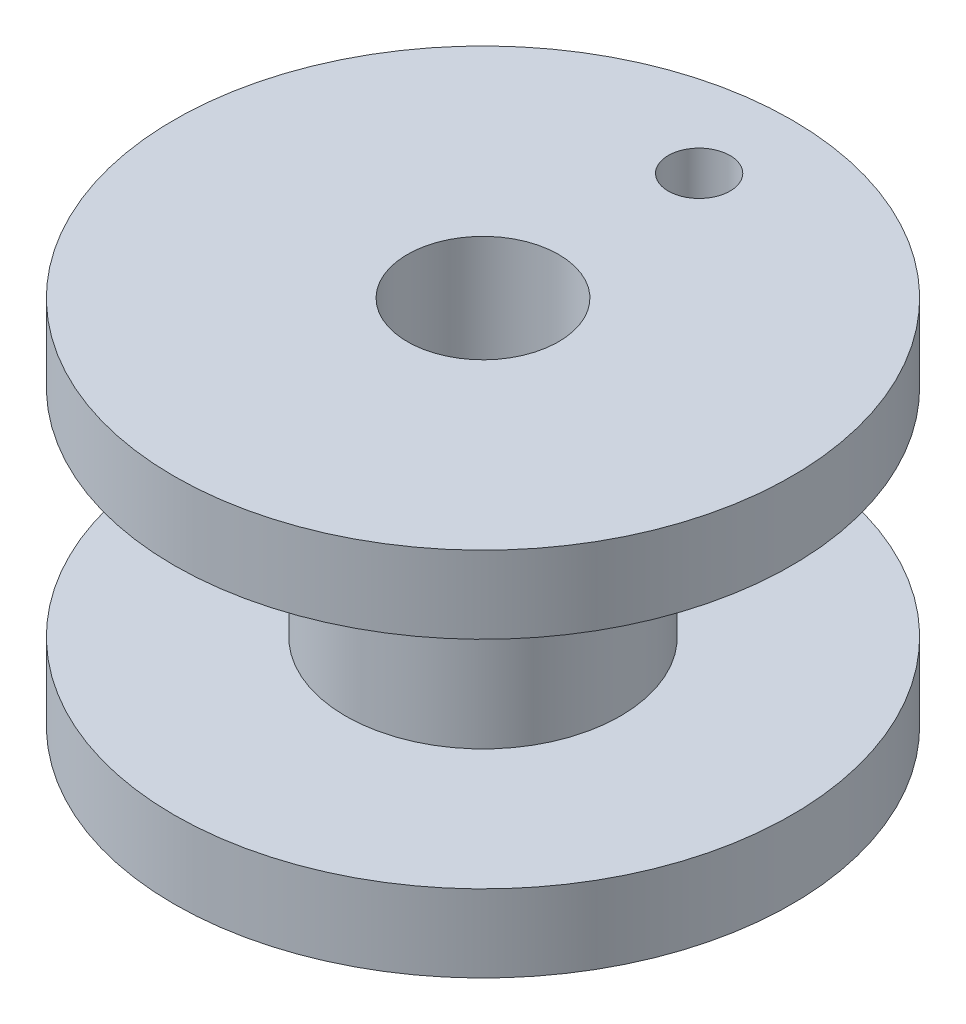
ISO-10303-21;
HEADER;
FILE_DESCRIPTION(('STEP AP214'),'2;1');
FILE_NAME('part.step','',(''),(''),'','','');
FILE_SCHEMA(('AUTOMOTIVE_DESIGN { 1 0 10303 214 1 1 1 1 }'));
ENDSEC;
DATA;
#1=APPLICATION_CONTEXT('core data for automotive mechanical design processes');
#2=APPLICATION_PROTOCOL_DEFINITION('international standard','automotive_design',2000,#1);
#3=PRODUCT_CONTEXT('',#1,'mechanical');
#4=PRODUCT('Part','Part','',(#3));
#5=PRODUCT_RELATED_PRODUCT_CATEGORY('part','',(#4));
#6=PRODUCT_DEFINITION_FORMATION('','',#4);
#7=PRODUCT_DEFINITION_CONTEXT('part definition',#1,'design');
#8=PRODUCT_DEFINITION('design','',#6,#7);
#9=PRODUCT_DEFINITION_SHAPE('','',#8);
#10=(LENGTH_UNIT() NAMED_UNIT(*) SI_UNIT(.MILLI.,.METRE.));
#11=(NAMED_UNIT(*) PLANE_ANGLE_UNIT() SI_UNIT($,.RADIAN.));
#12=(NAMED_UNIT(*) SI_UNIT($,.STERADIAN.) SOLID_ANGLE_UNIT());
#13=UNCERTAINTY_MEASURE_WITH_UNIT(LENGTH_MEASURE(1.E-05),#10,'distance_accuracy_value','');
#14=(GEOMETRIC_REPRESENTATION_CONTEXT(3) GLOBAL_UNCERTAINTY_ASSIGNED_CONTEXT((#13)) GLOBAL_UNIT_ASSIGNED_CONTEXT((#10,
#11,#12)) REPRESENTATION_CONTEXT('',''));
#15=CARTESIAN_POINT('',(0.,0.,0.));
#16=DIRECTION('',(0.,0.,1.));
#17=DIRECTION('',(1.,0.,0.));
#18=AXIS2_PLACEMENT_3D('',#15,#16,#17);
#19=CARTESIAN_POINT('',(0.,7.62,0.));
#20=DIRECTION('',(0.,-1.,0.));
#21=DIRECTION('',(0.,0.,-1.));
#22=AXIS2_PLACEMENT_3D('',#19,#20,#21);
#23=CYLINDRICAL_SURFACE('',#22,3.1115);
#24=CARTESIAN_POINT('',(0.,0.,0.));
#25=DIRECTION('',(0.,1.,0.));
#26=DIRECTION('',(0.,0.,1.));
#27=AXIS2_PLACEMENT_3D('',#24,#25,#26);
#28=CIRCLE('',#27,3.1115);
#29=CARTESIAN_POINT('',(0.,0.,-3.1115));
#30=VERTEX_POINT('',#29);
#31=EDGE_CURVE('E10',#30,#30,#28,.T.);
#32=CARTESIAN_POINT('',(0.,15.24,0.));
#33=DIRECTION('',(0.,1.,0.));
#34=DIRECTION('',(0.,0.,1.));
#35=AXIS2_PLACEMENT_3D('',#32,#33,#34);
#36=CIRCLE('',#35,3.1115);
#37=CARTESIAN_POINT('',(0.,15.24,-3.1115));
#38=VERTEX_POINT('',#37);
#39=EDGE_CURVE('E71',#38,#38,#36,.T.);
#40=CARTESIAN_POINT('',(0.,0.,-3.1115));
#41=CARTESIAN_POINT('',(0.,0.15875,-3.1115));
#42=CARTESIAN_POINT('',(0.,0.3175,-3.1115));
#43=CARTESIAN_POINT('',(0.,0.635,-3.1115));
#44=CARTESIAN_POINT('',(0.,0.79375,-3.1115));
#45=CARTESIAN_POINT('',(0.,1.11125,-3.1115));
#46=CARTESIAN_POINT('',(0.,1.27,-3.1115));
#47=CARTESIAN_POINT('',(0.,1.5875,-3.1115));
#48=CARTESIAN_POINT('',(0.,1.74625,-3.1115));
#49=CARTESIAN_POINT('',(0.,2.06375,-3.1115));
#50=CARTESIAN_POINT('',(0.,2.2225,-3.1115));
#51=CARTESIAN_POINT('',(0.,2.54,-3.1115));
#52=CARTESIAN_POINT('',(0.,2.69875,-3.1115));
#53=CARTESIAN_POINT('',(0.,3.01625,-3.1115));
#54=CARTESIAN_POINT('',(0.,3.175,-3.1115));
#55=CARTESIAN_POINT('',(0.,3.4925,-3.1115));
#56=CARTESIAN_POINT('',(0.,3.65125,-3.1115));
#57=CARTESIAN_POINT('',(0.,3.96875,-3.1115));
#58=CARTESIAN_POINT('',(0.,4.1275,-3.1115));
#59=CARTESIAN_POINT('',(0.,4.445,-3.1115));
#60=CARTESIAN_POINT('',(0.,4.60375,-3.1115));
#61=CARTESIAN_POINT('',(0.,4.92125,-3.1115));
#62=CARTESIAN_POINT('',(0.,5.08,-3.1115));
#63=CARTESIAN_POINT('',(0.,5.3975,-3.1115));
#64=CARTESIAN_POINT('',(0.,5.55625,-3.1115));
#65=CARTESIAN_POINT('',(0.,5.87375,-3.1115));
#66=CARTESIAN_POINT('',(0.,6.0325,-3.1115));
#67=CARTESIAN_POINT('',(0.,6.35,-3.1115));
#68=CARTESIAN_POINT('',(0.,6.50875,-3.1115));
#69=CARTESIAN_POINT('',(0.,6.82625,-3.1115));
#70=CARTESIAN_POINT('',(0.,6.985,-3.1115));
#71=CARTESIAN_POINT('',(0.,7.3025,-3.1115));
#72=CARTESIAN_POINT('',(0.,7.46125,-3.1115));
#73=CARTESIAN_POINT('',(0.,7.77875,-3.1115));
#74=CARTESIAN_POINT('',(0.,7.9375,-3.1115));
#75=CARTESIAN_POINT('',(0.,8.255,-3.1115));
#76=CARTESIAN_POINT('',(0.,8.41375,-3.1115));
#77=CARTESIAN_POINT('',(0.,8.73125,-3.1115));
#78=CARTESIAN_POINT('',(0.,8.89,-3.1115));
#79=CARTESIAN_POINT('',(0.,9.2075,-3.1115));
#80=CARTESIAN_POINT('',(0.,9.36625,-3.1115));
#81=CARTESIAN_POINT('',(0.,9.68375,-3.1115));
#82=CARTESIAN_POINT('',(0.,9.8425,-3.1115));
#83=CARTESIAN_POINT('',(0.,10.16,-3.1115));
#84=CARTESIAN_POINT('',(0.,10.31875,-3.1115));
#85=CARTESIAN_POINT('',(0.,10.63625,-3.1115));
#86=CARTESIAN_POINT('',(0.,10.795,-3.1115));
#87=CARTESIAN_POINT('',(0.,11.1125,-3.1115));
#88=CARTESIAN_POINT('',(0.,11.27125,-3.1115));
#89=CARTESIAN_POINT('',(0.,11.58875,-3.1115));
#90=CARTESIAN_POINT('',(0.,11.7475,-3.1115));
#91=CARTESIAN_POINT('',(0.,12.065,-3.1115));
#92=CARTESIAN_POINT('',(0.,12.22375,-3.1115));
#93=CARTESIAN_POINT('',(0.,12.54125,-3.1115));
#94=CARTESIAN_POINT('',(0.,12.7,-3.1115));
#95=CARTESIAN_POINT('',(0.,13.0175,-3.1115));
#96=CARTESIAN_POINT('',(0.,13.17625,-3.1115));
#97=CARTESIAN_POINT('',(0.,13.49375,-3.1115));
#98=CARTESIAN_POINT('',(0.,13.6525,-3.1115));
#99=CARTESIAN_POINT('',(0.,13.97,-3.1115));
#100=CARTESIAN_POINT('',(0.,14.12875,-3.1115));
#101=CARTESIAN_POINT('',(0.,14.44625,-3.1115));
#102=CARTESIAN_POINT('',(0.,14.605,-3.1115));
#103=CARTESIAN_POINT('',(0.,14.9225,-3.1115));
#104=CARTESIAN_POINT('',(0.,15.08125,-3.1115));
#105=CARTESIAN_POINT('',(0.,15.24,-3.1115));
#106=B_SPLINE_CURVE_WITH_KNOTS('',3,(#40,#41,#42,#43,#44,#45,#46,#47,#48,#49,#50,#51,#52,#53,
#54,#55,#56,#57,#58,#59,#60,#61,#62,#63,#64,#65,#66,#67,#68,#69,#70,#71,#72,#73,#74,#75,#76,#77,
#78,#79,#80,#81,#82,#83,#84,#85,#86,#87,#88,#89,#90,#91,#92,#93,#94,#95,#96,#97,#98,#99,#100,
#101,#102,#103,#104,#105),.UNSPECIFIED.,.F.,.F.,(4,2,2,2,2,2,2,2,2,2,2,2,2,2,2,2,2,2,2,2,2,2,2,
2,2,2,2,2,2,2,2,2,4),(0.,0.47625,0.9525,1.42875,1.905,2.38125,2.8575,3.33375,3.81,4.28625,
4.7625,5.23875,5.715,6.19125,6.6675,7.14375,7.62,8.09625,8.5725,9.04875,9.525,10.00125,10.4775,
10.95375,11.43,11.90625,12.3825,12.85875,13.335,13.81125,14.2875,14.76375,15.24),.UNSPECIFIED.);
#107=EDGE_CURVE('BSEAM45',#30,#38,#106,.T.);
#108=ORIENTED_EDGE('',*,*,#31,.F.);
#109=ORIENTED_EDGE('',*,*,#39,.T.);
#110=ORIENTED_EDGE('',*,*,#107,.T.);
#111=ORIENTED_EDGE('',*,*,#107,.F.);
#112=EDGE_LOOP('',(#108,#110,#109,#111));
#113=FACE_BOUND('',#112,.T.);
#114=ADVANCED_FACE('F45',(#113),#23,.F.);
#115=CARTESIAN_POINT('',(0.,7.62,0.));
#116=DIRECTION('',(0.,-1.,0.));
#117=DIRECTION('',(0.,0.,-1.));
#118=AXIS2_PLACEMENT_3D('',#115,#116,#117);
#119=CYLINDRICAL_SURFACE('',#118,5.6515);
#120=CARTESIAN_POINT('',(0.,12.065,0.));
#121=DIRECTION('',(0.,1.,0.));
#122=DIRECTION('',(0.,0.,1.));
#123=AXIS2_PLACEMENT_3D('',#120,#121,#122);
#124=CIRCLE('',#123,5.6515);
#125=CARTESIAN_POINT('',(0.,12.065,-5.6515));
#126=VERTEX_POINT('',#125);
#127=EDGE_CURVE('E97',#126,#126,#124,.T.);
#128=CARTESIAN_POINT('',(0.,3.175,0.));
#129=DIRECTION('',(0.,1.,0.));
#130=DIRECTION('',(0.,0.,1.));
#131=AXIS2_PLACEMENT_3D('',#128,#129,#130);
#132=CIRCLE('',#131,5.6515);
#133=CARTESIAN_POINT('',(0.,3.175,-5.6515));
#134=VERTEX_POINT('',#133);
#135=EDGE_CURVE('E57',#134,#134,#132,.T.);
#136=CARTESIAN_POINT('',(0.,12.065,-5.6515));
#137=CARTESIAN_POINT('',(0.,11.9723958333333,-5.6515));
#138=CARTESIAN_POINT('',(0.,11.8797916666667,-5.6515));
#139=CARTESIAN_POINT('',(0.,11.6945833333333,-5.6515));
#140=CARTESIAN_POINT('',(0.,11.6019791666667,-5.6515));
#141=CARTESIAN_POINT('',(0.,11.4167708333333,-5.6515));
#142=CARTESIAN_POINT('',(0.,11.3241666666667,-5.6515));
#143=CARTESIAN_POINT('',(0.,11.1389583333333,-5.6515));
#144=CARTESIAN_POINT('',(0.,11.0463541666667,-5.6515));
#145=CARTESIAN_POINT('',(0.,10.8611458333333,-5.6515));
#146=CARTESIAN_POINT('',(0.,10.7685416666667,-5.6515));
#147=CARTESIAN_POINT('',(0.,10.5833333333333,-5.6515));
#148=CARTESIAN_POINT('',(0.,10.4907291666667,-5.6515));
#149=CARTESIAN_POINT('',(0.,10.3055208333333,-5.6515));
#150=CARTESIAN_POINT('',(0.,10.2129166666667,-5.6515));
#151=CARTESIAN_POINT('',(0.,10.0277083333333,-5.6515));
#152=CARTESIAN_POINT('',(0.,9.93510416666666,-5.6515));
#153=CARTESIAN_POINT('',(0.,9.74989583333333,-5.6515));
#154=CARTESIAN_POINT('',(0.,9.65729166666666,-5.6515));
#155=CARTESIAN_POINT('',(0.,9.47208333333333,-5.6515));
#156=CARTESIAN_POINT('',(0.,9.37947916666666,-5.6515));
#157=CARTESIAN_POINT('',(0.,9.19427083333333,-5.6515));
#158=CARTESIAN_POINT('',(0.,9.10166666666666,-5.6515));
#159=CARTESIAN_POINT('',(0.,8.91645833333333,-5.6515));
#160=CARTESIAN_POINT('',(0.,8.82385416666666,-5.6515));
#161=CARTESIAN_POINT('',(0.,8.63864583333333,-5.6515));
#162=CARTESIAN_POINT('',(0.,8.54604166666666,-5.6515));
#163=CARTESIAN_POINT('',(0.,8.36083333333333,-5.6515));
#164=CARTESIAN_POINT('',(0.,8.26822916666666,-5.6515));
#165=CARTESIAN_POINT('',(0.,8.08302083333333,-5.6515));
#166=CARTESIAN_POINT('',(0.,7.99041666666666,-5.6515));
#167=CARTESIAN_POINT('',(0.,7.80520833333333,-5.6515));
#168=CARTESIAN_POINT('',(0.,7.71260416666667,-5.6515));
#169=CARTESIAN_POINT('',(0.,7.52739583333333,-5.6515));
#170=CARTESIAN_POINT('',(0.,7.43479166666666,-5.6515));
#171=CARTESIAN_POINT('',(0.,7.24958333333333,-5.6515));
#172=CARTESIAN_POINT('',(0.,7.15697916666667,-5.6515));
#173=CARTESIAN_POINT('',(0.,6.97177083333333,-5.6515));
#174=CARTESIAN_POINT('',(0.,6.87916666666667,-5.6515));
#175=CARTESIAN_POINT('',(0.,6.69395833333333,-5.6515));
#176=CARTESIAN_POINT('',(0.,6.60135416666667,-5.6515));
#177=CARTESIAN_POINT('',(0.,6.41614583333333,-5.6515));
#178=CARTESIAN_POINT('',(0.,6.32354166666666,-5.6515));
#179=CARTESIAN_POINT('',(0.,6.13833333333333,-5.6515));
#180=CARTESIAN_POINT('',(0.,6.04572916666667,-5.6515));
#181=CARTESIAN_POINT('',(0.,5.86052083333333,-5.6515));
#182=CARTESIAN_POINT('',(0.,5.76791666666667,-5.6515));
#183=CARTESIAN_POINT('',(0.,5.58270833333333,-5.6515));
#184=CARTESIAN_POINT('',(0.,5.49010416666667,-5.6515));
#185=CARTESIAN_POINT('',(0.,5.30489583333333,-5.6515));
#186=CARTESIAN_POINT('',(0.,5.21229166666667,-5.6515));
#187=CARTESIAN_POINT('',(0.,5.02708333333333,-5.6515));
#188=CARTESIAN_POINT('',(0.,4.93447916666667,-5.6515));
#189=CARTESIAN_POINT('',(0.,4.74927083333333,-5.6515));
#190=CARTESIAN_POINT('',(0.,4.65666666666667,-5.6515));
#191=CARTESIAN_POINT('',(0.,4.47145833333333,-5.6515));
#192=CARTESIAN_POINT('',(0.,4.37885416666667,-5.6515));
#193=CARTESIAN_POINT('',(0.,4.19364583333333,-5.6515));
#194=CARTESIAN_POINT('',(0.,4.10104166666667,-5.6515));
#195=CARTESIAN_POINT('',(0.,3.91583333333333,-5.6515));
#196=CARTESIAN_POINT('',(0.,3.82322916666667,-5.6515));
#197=CARTESIAN_POINT('',(0.,3.63802083333333,-5.6515));
#198=CARTESIAN_POINT('',(0.,3.54541666666667,-5.6515));
#199=CARTESIAN_POINT('',(0.,3.36020833333333,-5.6515));
#200=CARTESIAN_POINT('',(0.,3.26760416666667,-5.6515));
#201=CARTESIAN_POINT('',(0.,3.175,-5.6515));
#202=B_SPLINE_CURVE_WITH_KNOTS('',3,(#136,#137,#138,#139,#140,#141,#142,#143,#144,#145,#146,
#147,#148,#149,#150,#151,#152,#153,#154,#155,#156,#157,#158,#159,#160,#161,#162,#163,#164,#165,
#166,#167,#168,#169,#170,#171,#172,#173,#174,#175,#176,#177,#178,#179,#180,#181,#182,#183,#184,
#185,#186,#187,#188,#189,#190,#191,#192,#193,#194,#195,#196,#197,#198,#199,#200,#201),
.UNSPECIFIED.,.F.,.F.,(4,2,2,2,2,2,2,2,2,2,2,2,2,2,2,2,2,2,2,2,2,2,2,2,2,2,2,2,2,2,2,2,4),(0.,
0.2778125,0.555624999999999,0.833437499999999,1.11125,1.3890625,1.666875,1.9446875,2.2225,
2.5003125,2.778125,3.0559375,3.33375,3.6115625,3.889375,4.1671875,4.445,4.7228125,5.000625,
5.2784375,5.55625,5.8340625,6.111875,6.3896875,6.6675,6.9453125,7.223125,7.5009375,7.77875,
8.0565625,8.334375,8.6121875,8.89),.UNSPECIFIED.);
#203=EDGE_CURVE('BSEAM131',#126,#134,#202,.T.);
#204=ORIENTED_EDGE('',*,*,#127,.F.);
#205=ORIENTED_EDGE('',*,*,#135,.T.);
#206=ORIENTED_EDGE('',*,*,#203,.T.);
#207=ORIENTED_EDGE('',*,*,#203,.F.);
#208=EDGE_LOOP('',(#204,#206,#205,#207));
#209=FACE_BOUND('',#208,.T.);
#210=ADVANCED_FACE('F131',(#209),#119,.T.);
#211=CARTESIAN_POINT('',(0.,0.,0.));
#212=DIRECTION('',(0.,1.,0.));
#213=DIRECTION('',(0.,0.,1.));
#214=AXIS2_PLACEMENT_3D('',#211,#212,#213);
#215=PLANE('',#214);
#216=ORIENTED_EDGE('',*,*,#31,.T.);
#217=EDGE_LOOP('',(#216));
#218=FACE_BOUND('',#217,.T.);
#219=CARTESIAN_POINT('',(0.,0.,-8.89));
#220=DIRECTION('',(0.,1.,0.));
#221=DIRECTION('',(0.,0.,1.));
#222=AXIS2_PLACEMENT_3D('',#219,#220,#221);
#223=CIRCLE('',#222,1.27);
#224=CARTESIAN_POINT('',(0.,0.,-7.62));
#225=VERTEX_POINT('',#224);
#226=EDGE_CURVE('E67',#225,#225,#223,.T.);
#227=ORIENTED_EDGE('',*,*,#226,.T.);
#228=EDGE_LOOP('',(#227));
#229=FACE_BOUND('',#228,.T.);
#230=CARTESIAN_POINT('',(0.,0.,0.));
#231=DIRECTION('',(0.,1.,0.));
#232=DIRECTION('',(0.,0.,1.));
#233=AXIS2_PLACEMENT_3D('',#230,#231,#232);
#234=CIRCLE('',#233,12.7);
#235=CARTESIAN_POINT('',(0.,0.,12.7));
#236=VERTEX_POINT('',#235);
#237=EDGE_CURVE('E70',#236,#236,#234,.T.);
#238=ORIENTED_EDGE('',*,*,#237,.F.);
#239=EDGE_LOOP('',(#238));
#240=FACE_BOUND('',#239,.T.);
#241=ADVANCED_FACE('F137',(#218,#229,#240),#215,.F.);
#242=CARTESIAN_POINT('',(0.,3.175,-8.89));
#243=DIRECTION('',(0.,-1.,0.));
#244=DIRECTION('',(0.,0.,-1.));
#245=AXIS2_PLACEMENT_3D('',#242,#243,#244);
#246=CYLINDRICAL_SURFACE('',#245,1.27);
#247=CARTESIAN_POINT('',(0.,3.175,-8.89));
#248=DIRECTION('',(0.,1.,0.));
#249=DIRECTION('',(0.,0.,1.));
#250=AXIS2_PLACEMENT_3D('',#247,#248,#249);
#251=CIRCLE('',#250,1.27);
#252=CARTESIAN_POINT('',(0.,3.175,-7.62));
#253=VERTEX_POINT('',#252);
#254=EDGE_CURVE('E63',#253,#253,#251,.T.);
#255=ORIENTED_EDGE('',*,*,#254,.T.);
#256=EDGE_LOOP('',(#255));
#257=FACE_BOUND('',#256,.T.);
#258=ORIENTED_EDGE('',*,*,#226,.F.);
#259=EDGE_LOOP('',(#258));
#260=FACE_BOUND('',#259,.T.);
#261=ADVANCED_FACE('F144',(#257,#260),#246,.F.);
#262=CARTESIAN_POINT('',(0.,3.175,0.));
#263=DIRECTION('',(0.,-1.,0.));
#264=DIRECTION('',(0.,0.,-1.));
#265=AXIS2_PLACEMENT_3D('',#262,#263,#264);
#266=CYLINDRICAL_SURFACE('',#265,12.7);
#267=CARTESIAN_POINT('',(0.,3.175,0.));
#268=DIRECTION('',(0.,1.,0.));
#269=DIRECTION('',(0.,0.,1.));
#270=AXIS2_PLACEMENT_3D('',#267,#268,#269);
#271=CIRCLE('',#270,12.7);
#272=CARTESIAN_POINT('',(0.,3.175,12.7));
#273=VERTEX_POINT('',#272);
#274=EDGE_CURVE('E52',#273,#273,#271,.T.);
#275=ORIENTED_EDGE('',*,*,#274,.F.);
#276=EDGE_LOOP('',(#275));
#277=FACE_BOUND('',#276,.T.);
#278=ORIENTED_EDGE('',*,*,#237,.T.);
#279=EDGE_LOOP('',(#278));
#280=FACE_BOUND('',#279,.T.);
#281=ADVANCED_FACE('F151',(#277,#280),#266,.T.);
#282=CARTESIAN_POINT('',(0.,3.175,0.));
#283=DIRECTION('',(0.,1.,0.));
#284=DIRECTION('',(0.,0.,1.));
#285=AXIS2_PLACEMENT_3D('',#282,#283,#284);
#286=PLANE('',#285);
#287=ORIENTED_EDGE('',*,*,#254,.F.);
#288=EDGE_LOOP('',(#287));
#289=FACE_BOUND('',#288,.T.);
#290=ORIENTED_EDGE('',*,*,#135,.F.);
#291=EDGE_LOOP('',(#290));
#292=FACE_BOUND('',#291,.T.);
#293=ORIENTED_EDGE('',*,*,#274,.T.);
#294=EDGE_LOOP('',(#293));
#295=FACE_BOUND('',#294,.T.);
#296=ADVANCED_FACE('F118',(#289,#292,#295),#286,.T.);
#297=CARTESIAN_POINT('',(0.,15.24,0.));
#298=DIRECTION('',(0.,-1.,0.));
#299=DIRECTION('',(0.,0.,1.));
#300=AXIS2_PLACEMENT_3D('',#297,#298,#299);
#301=PLANE('',#300);
#302=ORIENTED_EDGE('',*,*,#39,.F.);
#303=EDGE_LOOP('',(#302));
#304=FACE_BOUND('',#303,.T.);
#305=CARTESIAN_POINT('',(0.,15.24,-8.89));
#306=DIRECTION('',(0.,1.,0.));
#307=DIRECTION('',(0.,0.,1.));
#308=AXIS2_PLACEMENT_3D('',#305,#306,#307);
#309=CIRCLE('',#308,1.27);
#310=CARTESIAN_POINT('',(0.,15.24,-7.62));
#311=VERTEX_POINT('',#310);
#312=EDGE_CURVE('E90',#311,#311,#309,.T.);
#313=ORIENTED_EDGE('',*,*,#312,.F.);
#314=EDGE_LOOP('',(#313));
#315=FACE_BOUND('',#314,.T.);
#316=CARTESIAN_POINT('',(0.,15.24,0.));
#317=DIRECTION('',(0.,1.,0.));
#318=DIRECTION('',(0.,0.,1.));
#319=AXIS2_PLACEMENT_3D('',#316,#317,#318);
#320=CIRCLE('',#319,12.7);
#321=CARTESIAN_POINT('',(0.,15.24,12.7));
#322=VERTEX_POINT('',#321);
#323=EDGE_CURVE('E85',#322,#322,#320,.T.);
#324=ORIENTED_EDGE('',*,*,#323,.T.);
#325=EDGE_LOOP('',(#324));
#326=FACE_BOUND('',#325,.T.);
#327=ADVANCED_FACE('F112',(#304,#315,#326),#301,.F.);
#328=CARTESIAN_POINT('',(0.,12.065,-8.89));
#329=DIRECTION('',(0.,1.,0.));
#330=DIRECTION('',(0.,0.,1.));
#331=AXIS2_PLACEMENT_3D('',#328,#329,#330);
#332=CYLINDRICAL_SURFACE('',#331,1.27);
#333=CARTESIAN_POINT('',(0.,12.065,-8.89));
#334=DIRECTION('',(0.,1.,0.));
#335=DIRECTION('',(0.,0.,1.));
#336=AXIS2_PLACEMENT_3D('',#333,#334,#335);
#337=CIRCLE('',#336,1.27);
#338=CARTESIAN_POINT('',(0.,12.065,-7.62));
#339=VERTEX_POINT('',#338);
#340=EDGE_CURVE('E89',#339,#339,#337,.T.);
#341=ORIENTED_EDGE('',*,*,#340,.F.);
#342=EDGE_LOOP('',(#341));
#343=FACE_BOUND('',#342,.T.);
#344=ORIENTED_EDGE('',*,*,#312,.T.);
#345=EDGE_LOOP('',(#344));
#346=FACE_BOUND('',#345,.T.);
#347=ADVANCED_FACE('F108',(#343,#346),#332,.F.);
#348=CARTESIAN_POINT('',(0.,12.065,0.));
#349=DIRECTION('',(0.,1.,0.));
#350=DIRECTION('',(0.,0.,1.));
#351=AXIS2_PLACEMENT_3D('',#348,#349,#350);
#352=CYLINDRICAL_SURFACE('',#351,12.7);
#353=CARTESIAN_POINT('',(0.,12.065,0.));
#354=DIRECTION('',(0.,1.,0.));
#355=DIRECTION('',(0.,0.,1.));
#356=AXIS2_PLACEMENT_3D('',#353,#354,#355);
#357=CIRCLE('',#356,12.7);
#358=CARTESIAN_POINT('',(0.,12.065,12.7));
#359=VERTEX_POINT('',#358);
#360=EDGE_CURVE('E84',#359,#359,#357,.T.);
#361=ORIENTED_EDGE('',*,*,#360,.T.);
#362=EDGE_LOOP('',(#361));
#363=FACE_BOUND('',#362,.T.);
#364=ORIENTED_EDGE('',*,*,#323,.F.);
#365=EDGE_LOOP('',(#364));
#366=FACE_BOUND('',#365,.T.);
#367=ADVANCED_FACE('F111',(#363,#366),#352,.T.);
#368=CARTESIAN_POINT('',(0.,12.065,0.));
#369=DIRECTION('',(0.,-1.,0.));
#370=DIRECTION('',(0.,0.,1.));
#371=AXIS2_PLACEMENT_3D('',#368,#369,#370);
#372=PLANE('',#371);
#373=ORIENTED_EDGE('',*,*,#340,.T.);
#374=EDGE_LOOP('',(#373));
#375=FACE_BOUND('',#374,.T.);
#376=ORIENTED_EDGE('',*,*,#127,.T.);
#377=EDGE_LOOP('',(#376));
#378=FACE_BOUND('',#377,.T.);
#379=ORIENTED_EDGE('',*,*,#360,.F.);
#380=EDGE_LOOP('',(#379));
#381=FACE_BOUND('',#380,.T.);
#382=ADVANCED_FACE('F105',(#375,#378,#381),#372,.T.);
#383=CLOSED_SHELL('',(#114,#210,#241,#261,#281,#296,#327,#347,#367,#382));
#384=MANIFOLD_SOLID_BREP('B2',#383);
#385=ADVANCED_BREP_SHAPE_REPRESENTATION('',(#18,#384),#14);
#386=SHAPE_DEFINITION_REPRESENTATION(#9,#385);
ENDSEC;
END-ISO-10303-21;
